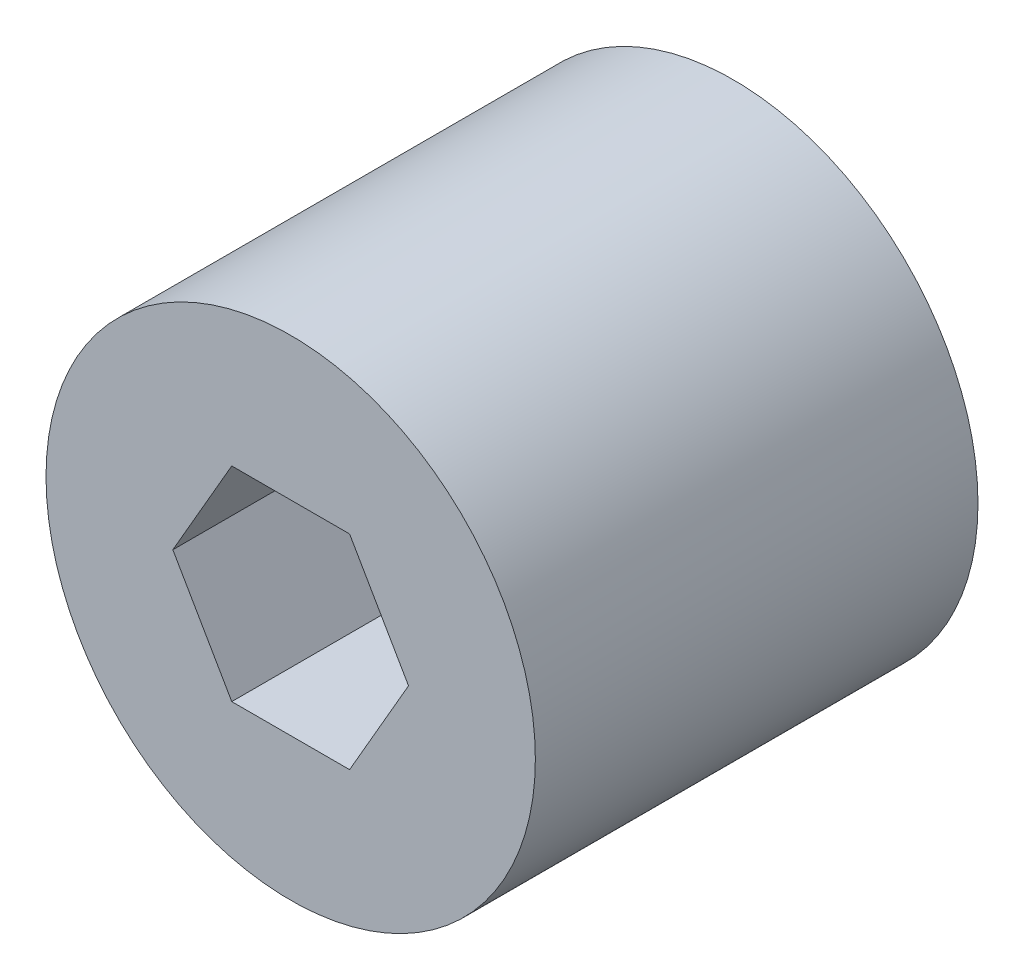
ISO-10303-21;
HEADER;
FILE_DESCRIPTION(('STEP AP214'),'2;1');
FILE_NAME('part.step','',(''),(''),'','','');
FILE_SCHEMA(('AUTOMOTIVE_DESIGN { 1 0 10303 214 1 1 1 1 }'));
ENDSEC;
DATA;
#1=APPLICATION_CONTEXT('core data for automotive mechanical design processes');
#2=APPLICATION_PROTOCOL_DEFINITION('international standard','automotive_design',2000,#1);
#3=PRODUCT_CONTEXT('',#1,'mechanical');
#4=PRODUCT('Part','Part','',(#3));
#5=PRODUCT_RELATED_PRODUCT_CATEGORY('part','',(#4));
#6=PRODUCT_DEFINITION_FORMATION('','',#4);
#7=PRODUCT_DEFINITION_CONTEXT('part definition',#1,'design');
#8=PRODUCT_DEFINITION('design','',#6,#7);
#9=PRODUCT_DEFINITION_SHAPE('','',#8);
#10=(LENGTH_UNIT() NAMED_UNIT(*) SI_UNIT(.MILLI.,.METRE.));
#11=(NAMED_UNIT(*) PLANE_ANGLE_UNIT() SI_UNIT($,.RADIAN.));
#12=(NAMED_UNIT(*) SI_UNIT($,.STERADIAN.) SOLID_ANGLE_UNIT());
#13=UNCERTAINTY_MEASURE_WITH_UNIT(LENGTH_MEASURE(1.E-05),#10,'distance_accuracy_value','');
#14=(GEOMETRIC_REPRESENTATION_CONTEXT(3) GLOBAL_UNCERTAINTY_ASSIGNED_CONTEXT((#13)) GLOBAL_UNIT_ASSIGNED_CONTEXT((#10,
#11,#12)) REPRESENTATION_CONTEXT('',''));
#15=CARTESIAN_POINT('',(0.,0.,0.));
#16=DIRECTION('',(0.,0.,1.));
#17=DIRECTION('',(1.,0.,0.));
#18=AXIS2_PLACEMENT_3D('',#15,#16,#17);
#19=CARTESIAN_POINT('',(0.,0.,9.));
#20=DIRECTION('',(0.,0.,-1.));
#21=DIRECTION('',(-1.,0.,0.));
#22=AXIS2_PLACEMENT_3D('',#19,#20,#21);
#23=CYLINDRICAL_SURFACE('',#22,4.975);
#24=CARTESIAN_POINT('',(0.,0.,9.));
#25=DIRECTION('',(0.,0.,1.));
#26=DIRECTION('',(1.,0.,0.));
#27=AXIS2_PLACEMENT_3D('',#24,#25,#26);
#28=CIRCLE('',#27,4.975);
#29=CARTESIAN_POINT('',(4.975,0.,9.));
#30=VERTEX_POINT('',#29);
#31=EDGE_CURVE('E11',#30,#30,#28,.T.);
#32=ORIENTED_EDGE('',*,*,#31,.F.);
#33=EDGE_LOOP('',(#32));
#34=FACE_BOUND('',#33,.T.);
#35=CARTESIAN_POINT('',(0.,0.,0.));
#36=DIRECTION('',(0.,0.,1.));
#37=DIRECTION('',(1.,0.,0.));
#38=AXIS2_PLACEMENT_3D('',#35,#36,#37);
#39=CIRCLE('',#38,4.975);
#40=CARTESIAN_POINT('',(4.975,0.,0.));
#41=VERTEX_POINT('',#40);
#42=EDGE_CURVE('E40',#41,#41,#39,.T.);
#43=ORIENTED_EDGE('',*,*,#42,.T.);
#44=EDGE_LOOP('',(#43));
#45=FACE_BOUND('',#44,.T.);
#46=ADVANCED_FACE('F37',(#34,#45),#23,.T.);
#47=CARTESIAN_POINT('',(0.,0.,9.));
#48=DIRECTION('',(0.,0.,1.));
#49=DIRECTION('',(1.,0.,0.));
#50=AXIS2_PLACEMENT_3D('',#47,#48,#49);
#51=PLANE('',#50);
#52=DIRECTION('',(0.5,0.866025403784439,0.));
#53=VECTOR('',#52,1.);
#54=CARTESIAN_POINT('',(1.19800180856847,-2.075,9.));
#55=LINE('',#54,#53);
#56=CARTESIAN_POINT('',(1.19800180856847,-2.075,9.));
#57=VERTEX_POINT('',#56);
#58=CARTESIAN_POINT('',(2.39600361713695,0.,9.));
#59=VERTEX_POINT('',#58);
#60=EDGE_CURVE('E51',#57,#59,#55,.T.);
#61=ORIENTED_EDGE('',*,*,#60,.F.);
#62=DIRECTION('',(1.,0.,0.));
#63=VECTOR('',#62,1.);
#64=CARTESIAN_POINT('',(-1.19800180856847,-2.075,9.));
#65=LINE('',#64,#63);
#66=CARTESIAN_POINT('',(-1.19800180856847,-2.075,9.));
#67=VERTEX_POINT('',#66);
#68=EDGE_CURVE('E134',#67,#57,#65,.T.);
#69=ORIENTED_EDGE('',*,*,#68,.F.);
#70=DIRECTION('',(0.5,-0.866025403784438,0.));
#71=VECTOR('',#70,1.);
#72=CARTESIAN_POINT('',(-2.39600361713695,0.,9.));
#73=LINE('',#72,#71);
#74=CARTESIAN_POINT('',(-2.39600361713695,0.,9.));
#75=VERTEX_POINT('',#74);
#76=EDGE_CURVE('E132',#75,#67,#73,.T.);
#77=ORIENTED_EDGE('',*,*,#76,.F.);
#78=DIRECTION('',(-0.5,-0.866025403784439,0.));
#79=VECTOR('',#78,1.);
#80=CARTESIAN_POINT('',(-1.19800180856847,2.075,9.));
#81=LINE('',#80,#79);
#82=CARTESIAN_POINT('',(-1.19800180856847,2.075,9.));
#83=VERTEX_POINT('',#82);
#84=EDGE_CURVE('E99',#83,#75,#81,.T.);
#85=ORIENTED_EDGE('',*,*,#84,.F.);
#86=DIRECTION('',(-1.,0.,0.));
#87=VECTOR('',#86,1.);
#88=CARTESIAN_POINT('',(1.19800180856847,2.075,9.));
#89=LINE('',#88,#87);
#90=CARTESIAN_POINT('',(1.19800180856847,2.075,9.));
#91=VERTEX_POINT('',#90);
#92=EDGE_CURVE('E128',#91,#83,#89,.T.);
#93=ORIENTED_EDGE('',*,*,#92,.F.);
#94=DIRECTION('',(-0.5,0.866025403784438,0.));
#95=VECTOR('',#94,1.);
#96=CARTESIAN_POINT('',(2.39600361713695,0.,9.));
#97=LINE('',#96,#95);
#98=EDGE_CURVE('E125',#59,#91,#97,.T.);
#99=ORIENTED_EDGE('',*,*,#98,.F.);
#100=EDGE_LOOP('',(#61,#69,#77,#85,#93,#99));
#101=FACE_BOUND('',#100,.T.);
#102=ORIENTED_EDGE('',*,*,#31,.T.);
#103=EDGE_LOOP('',(#102));
#104=FACE_BOUND('',#103,.T.);
#105=ADVANCED_FACE('F147',(#101,#104),#51,.T.);
#106=CARTESIAN_POINT('',(0.,0.,0.));
#107=DIRECTION('',(0.,0.,1.));
#108=DIRECTION('',(1.,0.,0.));
#109=AXIS2_PLACEMENT_3D('',#106,#107,#108);
#110=PLANE('',#109);
#111=ORIENTED_EDGE('',*,*,#42,.F.);
#112=EDGE_LOOP('',(#111));
#113=FACE_BOUND('',#112,.T.);
#114=ADVANCED_FACE('F156',(#113),#110,.F.);
#115=CARTESIAN_POINT('',(1.19800180856847,-2.075,1.5));
#116=DIRECTION('',(0.866025403784439,-0.5,0.));
#117=DIRECTION('',(0.5,0.866025403784439,0.));
#118=AXIS2_PLACEMENT_3D('',#115,#116,#117);
#119=PLANE('',#118);
#120=ORIENTED_EDGE('',*,*,#60,.T.);
#121=DIRECTION('',(0.,0.,1.));
#122=VECTOR('',#121,1.);
#123=CARTESIAN_POINT('',(2.39600361713695,0.,1.5));
#124=LINE('',#123,#122);
#125=CARTESIAN_POINT('',(2.39600361713695,0.,1.5));
#126=VERTEX_POINT('',#125);
#127=EDGE_CURVE('E81',#126,#59,#124,.T.);
#128=ORIENTED_EDGE('',*,*,#127,.F.);
#129=DIRECTION('',(0.5,0.866025403784439,0.));
#130=VECTOR('',#129,1.);
#131=CARTESIAN_POINT('',(1.19800180856847,-2.075,1.5));
#132=LINE('',#131,#130);
#133=CARTESIAN_POINT('',(1.19800180856847,-2.075,1.5));
#134=VERTEX_POINT('',#133);
#135=EDGE_CURVE('E136',#134,#126,#132,.T.);
#136=ORIENTED_EDGE('',*,*,#135,.F.);
#137=DIRECTION('',(0.,0.,1.));
#138=VECTOR('',#137,1.);
#139=CARTESIAN_POINT('',(1.19800180856847,-2.075,1.5));
#140=LINE('',#139,#138);
#141=EDGE_CURVE('E59',#134,#57,#140,.T.);
#142=ORIENTED_EDGE('',*,*,#141,.T.);
#143=EDGE_LOOP('',(#120,#128,#136,#142));
#144=FACE_BOUND('',#143,.T.);
#145=ADVANCED_FACE('F153',(#144),#119,.F.);
#146=CARTESIAN_POINT('',(-1.19800180856847,-2.075,1.5));
#147=DIRECTION('',(0.,-1.,0.));
#148=DIRECTION('',(0.,0.,-1.));
#149=AXIS2_PLACEMENT_3D('',#146,#147,#148);
#150=PLANE('',#149);
#151=ORIENTED_EDGE('',*,*,#68,.T.);
#152=ORIENTED_EDGE('',*,*,#141,.F.);
#153=DIRECTION('',(1.,0.,0.));
#154=VECTOR('',#153,1.);
#155=CARTESIAN_POINT('',(-1.19800180856847,-2.075,1.5));
#156=LINE('',#155,#154);
#157=CARTESIAN_POINT('',(-1.19800180856847,-2.075,1.5));
#158=VERTEX_POINT('',#157);
#159=EDGE_CURVE('E111',#158,#134,#156,.T.);
#160=ORIENTED_EDGE('',*,*,#159,.F.);
#161=DIRECTION('',(0.,0.,1.));
#162=VECTOR('',#161,1.);
#163=CARTESIAN_POINT('',(-1.19800180856847,-2.075,1.5));
#164=LINE('',#163,#162);
#165=EDGE_CURVE('E103',#158,#67,#164,.T.);
#166=ORIENTED_EDGE('',*,*,#165,.T.);
#167=EDGE_LOOP('',(#151,#152,#160,#166));
#168=FACE_BOUND('',#167,.T.);
#169=ADVANCED_FACE('F155',(#168),#150,.F.);
#170=CARTESIAN_POINT('',(-2.39600361713695,0.,1.5));
#171=DIRECTION('',(-0.866025403784438,-0.5,0.));
#172=DIRECTION('',(0.5,-0.866025403784439,0.));
#173=AXIS2_PLACEMENT_3D('',#170,#171,#172);
#174=PLANE('',#173);
#175=ORIENTED_EDGE('',*,*,#76,.T.);
#176=ORIENTED_EDGE('',*,*,#165,.F.);
#177=DIRECTION('',(0.5,-0.866025403784438,0.));
#178=VECTOR('',#177,1.);
#179=CARTESIAN_POINT('',(-2.39600361713695,0.,1.5));
#180=LINE('',#179,#178);
#181=CARTESIAN_POINT('',(-2.39600361713695,0.,1.5));
#182=VERTEX_POINT('',#181);
#183=EDGE_CURVE('E107',#182,#158,#180,.T.);
#184=ORIENTED_EDGE('',*,*,#183,.F.);
#185=DIRECTION('',(0.,0.,1.));
#186=VECTOR('',#185,1.);
#187=CARTESIAN_POINT('',(-2.39600361713695,0.,1.5));
#188=LINE('',#187,#186);
#189=EDGE_CURVE('E92',#182,#75,#188,.T.);
#190=ORIENTED_EDGE('',*,*,#189,.T.);
#191=EDGE_LOOP('',(#175,#176,#184,#190));
#192=FACE_BOUND('',#191,.T.);
#193=ADVANCED_FACE('F108',(#192),#174,.F.);
#194=CARTESIAN_POINT('',(-1.19800180856847,2.075,1.5));
#195=DIRECTION('',(-0.866025403784438,0.5,0.));
#196=DIRECTION('',(-0.5,-0.866025403784439,0.));
#197=AXIS2_PLACEMENT_3D('',#194,#195,#196);
#198=PLANE('',#197);
#199=ORIENTED_EDGE('',*,*,#84,.T.);
#200=ORIENTED_EDGE('',*,*,#189,.F.);
#201=DIRECTION('',(-0.5,-0.866025403784439,0.));
#202=VECTOR('',#201,1.);
#203=CARTESIAN_POINT('',(-1.19800180856847,2.075,1.5));
#204=LINE('',#203,#202);
#205=CARTESIAN_POINT('',(-1.19800180856847,2.075,1.5));
#206=VERTEX_POINT('',#205);
#207=EDGE_CURVE('E96',#206,#182,#204,.T.);
#208=ORIENTED_EDGE('',*,*,#207,.F.);
#209=DIRECTION('',(0.,0.,1.));
#210=VECTOR('',#209,1.);
#211=CARTESIAN_POINT('',(-1.19800180856847,2.075,1.5));
#212=LINE('',#211,#210);
#213=EDGE_CURVE('E104',#206,#83,#212,.T.);
#214=ORIENTED_EDGE('',*,*,#213,.T.);
#215=EDGE_LOOP('',(#199,#200,#208,#214));
#216=FACE_BOUND('',#215,.T.);
#217=ADVANCED_FACE('F94',(#216),#198,.F.);
#218=CARTESIAN_POINT('',(1.19800180856847,2.075,1.5));
#219=DIRECTION('',(0.,1.,0.));
#220=DIRECTION('',(-1.,0.,0.));
#221=AXIS2_PLACEMENT_3D('',#218,#219,#220);
#222=PLANE('',#221);
#223=ORIENTED_EDGE('',*,*,#92,.T.);
#224=ORIENTED_EDGE('',*,*,#213,.F.);
#225=DIRECTION('',(-1.,0.,0.));
#226=VECTOR('',#225,1.);
#227=CARTESIAN_POINT('',(1.19800180856847,2.075,1.5));
#228=LINE('',#227,#226);
#229=CARTESIAN_POINT('',(1.19800180856847,2.075,1.5));
#230=VERTEX_POINT('',#229);
#231=EDGE_CURVE('E117',#230,#206,#228,.T.);
#232=ORIENTED_EDGE('',*,*,#231,.F.);
#233=DIRECTION('',(0.,0.,1.));
#234=VECTOR('',#233,1.);
#235=CARTESIAN_POINT('',(1.19800180856847,2.075,1.5));
#236=LINE('',#235,#234);
#237=EDGE_CURVE('E140',#230,#91,#236,.T.);
#238=ORIENTED_EDGE('',*,*,#237,.T.);
#239=EDGE_LOOP('',(#223,#224,#232,#238));
#240=FACE_BOUND('',#239,.T.);
#241=ADVANCED_FACE('F151',(#240),#222,.F.);
#242=CARTESIAN_POINT('',(2.39600361713695,0.,1.5));
#243=DIRECTION('',(0.866025403784438,0.5,0.));
#244=DIRECTION('',(-0.5,0.866025403784438,0.));
#245=AXIS2_PLACEMENT_3D('',#242,#243,#244);
#246=PLANE('',#245);
#247=ORIENTED_EDGE('',*,*,#98,.T.);
#248=ORIENTED_EDGE('',*,*,#237,.F.);
#249=DIRECTION('',(-0.5,0.866025403784438,0.));
#250=VECTOR('',#249,1.);
#251=CARTESIAN_POINT('',(2.39600361713695,0.,1.5));
#252=LINE('',#251,#250);
#253=EDGE_CURVE('E119',#126,#230,#252,.T.);
#254=ORIENTED_EDGE('',*,*,#253,.F.);
#255=ORIENTED_EDGE('',*,*,#127,.T.);
#256=EDGE_LOOP('',(#247,#248,#254,#255));
#257=FACE_BOUND('',#256,.T.);
#258=ADVANCED_FACE('F144',(#257),#246,.F.);
#259=CARTESIAN_POINT('',(0.,0.,1.5));
#260=DIRECTION('',(0.,0.,1.));
#261=DIRECTION('',(1.,0.,0.));
#262=AXIS2_PLACEMENT_3D('',#259,#260,#261);
#263=PLANE('',#262);
#264=ORIENTED_EDGE('',*,*,#135,.T.);
#265=ORIENTED_EDGE('',*,*,#253,.T.);
#266=ORIENTED_EDGE('',*,*,#231,.T.);
#267=ORIENTED_EDGE('',*,*,#207,.T.);
#268=ORIENTED_EDGE('',*,*,#183,.T.);
#269=ORIENTED_EDGE('',*,*,#159,.T.);
#270=EDGE_LOOP('',(#264,#265,#266,#267,#268,#269));
#271=FACE_BOUND('',#270,.T.);
#272=ADVANCED_FACE('F114',(#271),#263,.T.);
#273=CLOSED_SHELL('',(#46,#105,#114,#145,#169,#193,#217,#241,#258,#272));
#274=MANIFOLD_SOLID_BREP('B2',#273);
#275=ADVANCED_BREP_SHAPE_REPRESENTATION('',(#18,#274),#14);
#276=SHAPE_DEFINITION_REPRESENTATION(#9,#275);
ENDSEC;
END-ISO-10303-21;
